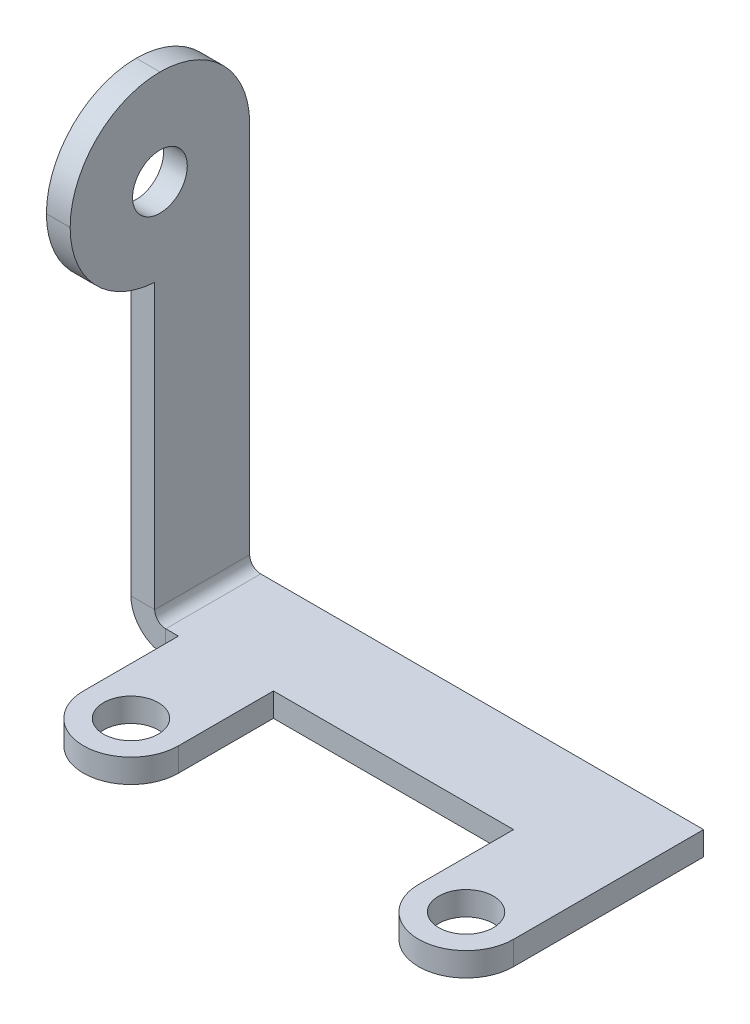
ISO-10303-21;
HEADER;
FILE_DESCRIPTION(('STEP AP214'),'2;1');
FILE_NAME('part.step','',(''),(''),'','','');
FILE_SCHEMA(('AUTOMOTIVE_DESIGN { 1 0 10303 214 1 1 1 1 }'));
ENDSEC;
DATA;
#1=APPLICATION_CONTEXT('core data for automotive mechanical design processes');
#2=APPLICATION_PROTOCOL_DEFINITION('international standard','automotive_design',2000,#1);
#3=PRODUCT_CONTEXT('',#1,'mechanical');
#4=PRODUCT('Part','Part','',(#3));
#5=PRODUCT_RELATED_PRODUCT_CATEGORY('part','',(#4));
#6=PRODUCT_DEFINITION_FORMATION('','',#4);
#7=PRODUCT_DEFINITION_CONTEXT('part definition',#1,'design');
#8=PRODUCT_DEFINITION('design','',#6,#7);
#9=PRODUCT_DEFINITION_SHAPE('','',#8);
#10=(LENGTH_UNIT() NAMED_UNIT(*) SI_UNIT(.MILLI.,.METRE.));
#11=(NAMED_UNIT(*) PLANE_ANGLE_UNIT() SI_UNIT($,.RADIAN.));
#12=(NAMED_UNIT(*) SI_UNIT($,.STERADIAN.) SOLID_ANGLE_UNIT());
#13=UNCERTAINTY_MEASURE_WITH_UNIT(LENGTH_MEASURE(1.E-05),#10,'distance_accuracy_value','');
#14=(GEOMETRIC_REPRESENTATION_CONTEXT(3) GLOBAL_UNCERTAINTY_ASSIGNED_CONTEXT((#13)) GLOBAL_UNIT_ASSIGNED_CONTEXT((#10,
#11,#12)) REPRESENTATION_CONTEXT('',''));
#15=CARTESIAN_POINT('',(0.,0.,0.));
#16=DIRECTION('',(0.,0.,1.));
#17=DIRECTION('',(1.,0.,0.));
#18=AXIS2_PLACEMENT_3D('',#15,#16,#17);
#19=CARTESIAN_POINT('',(-22.4,1.5875,0.));
#20=DIRECTION('',(0.,-1.,0.));
#21=DIRECTION('',(0.,0.,-1.));
#22=AXIS2_PLACEMENT_3D('',#19,#20,#21);
#23=PLANE('',#22);
#24=CARTESIAN_POINT('',(-22.4,1.5875,0.));
#25=DIRECTION('',(0.,1.,0.));
#26=DIRECTION('',(0.,0.,1.));
#27=AXIS2_PLACEMENT_3D('',#24,#25,#26);
#28=CIRCLE('',#27,1.8288);
#29=CARTESIAN_POINT('',(-22.4,1.5875,1.8288));
#30=VERTEX_POINT('',#29);
#31=EDGE_CURVE('E225',#30,#30,#28,.T.);
#32=ORIENTED_EDGE('',*,*,#31,.F.);
#33=EDGE_LOOP('',(#32));
#34=FACE_BOUND('',#33,.T.);
#35=CARTESIAN_POINT('',(0.,1.5875,0.));
#36=DIRECTION('',(0.,1.,0.));
#37=DIRECTION('',(0.,0.,1.));
#38=AXIS2_PLACEMENT_3D('',#35,#36,#37);
#39=CIRCLE('',#38,1.8288);
#40=CARTESIAN_POINT('',(0.,1.5875,1.8288));
#41=VERTEX_POINT('',#40);
#42=EDGE_CURVE('E231',#41,#41,#39,.T.);
#43=ORIENTED_EDGE('',*,*,#42,.F.);
#44=EDGE_LOOP('',(#43));
#45=FACE_BOUND('',#44,.T.);
#46=DIRECTION('',(0.,0.,1.));
#47=VECTOR('',#46,1.);
#48=CARTESIAN_POINT('',(-26.4259,1.5875,-6.35));
#49=LINE('',#48,#47);
#50=CARTESIAN_POINT('',(-26.4259,1.5875,-6.35));
#51=VERTEX_POINT('',#50);
#52=CARTESIAN_POINT('',(-26.4259,1.5875,-12.7));
#53=VERTEX_POINT('',#52);
#54=EDGE_CURVE('E215',#51,#53,#49,.F.);
#55=ORIENTED_EDGE('',*,*,#54,.F.);
#56=DIRECTION('',(1.,0.,0.));
#57=VECTOR('',#56,1.);
#58=CARTESIAN_POINT('',(-25.575,1.5875,-6.35));
#59=LINE('',#58,#57);
#60=CARTESIAN_POINT('',(-25.575,1.5875,-6.35));
#61=VERTEX_POINT('',#60);
#62=EDGE_CURVE('E237',#51,#61,#59,.T.);
#63=ORIENTED_EDGE('',*,*,#62,.T.);
#64=DIRECTION('',(0.,0.,1.));
#65=VECTOR('',#64,1.);
#66=CARTESIAN_POINT('',(-25.575,1.5875,0.));
#67=LINE('',#66,#65);
#68=CARTESIAN_POINT('',(-25.575,1.5875,0.));
#69=VERTEX_POINT('',#68);
#70=EDGE_CURVE('E239',#61,#69,#67,.T.);
#71=ORIENTED_EDGE('',*,*,#70,.T.);
#72=CARTESIAN_POINT('',(-22.4,1.5875,0.));
#73=DIRECTION('',(0.,1.,0.));
#74=DIRECTION('',(0.,0.,-1.));
#75=AXIS2_PLACEMENT_3D('',#72,#73,#74);
#76=CIRCLE('',#75,3.175);
#77=CARTESIAN_POINT('',(-19.225,1.5875,0.));
#78=VERTEX_POINT('',#77);
#79=EDGE_CURVE('E242',#69,#78,#76,.T.);
#80=ORIENTED_EDGE('',*,*,#79,.T.);
#81=DIRECTION('',(0.,0.,-1.));
#82=VECTOR('',#81,1.);
#83=CARTESIAN_POINT('',(-19.225,1.5875,-6.35));
#84=LINE('',#83,#82);
#85=CARTESIAN_POINT('',(-19.225,1.5875,-6.35));
#86=VERTEX_POINT('',#85);
#87=EDGE_CURVE('E244',#78,#86,#84,.T.);
#88=ORIENTED_EDGE('',*,*,#87,.T.);
#89=DIRECTION('',(1.,0.,0.));
#90=VECTOR('',#89,1.);
#91=CARTESIAN_POINT('',(-3.175,1.5875,-6.35));
#92=LINE('',#91,#90);
#93=CARTESIAN_POINT('',(-3.175,1.5875,-6.35));
#94=VERTEX_POINT('',#93);
#95=EDGE_CURVE('E246',#86,#94,#92,.T.);
#96=ORIENTED_EDGE('',*,*,#95,.T.);
#97=DIRECTION('',(0.,0.,1.));
#98=VECTOR('',#97,1.);
#99=CARTESIAN_POINT('',(-3.175,1.5875,0.));
#100=LINE('',#99,#98);
#101=CARTESIAN_POINT('',(-3.175,1.5875,0.));
#102=VERTEX_POINT('',#101);
#103=EDGE_CURVE('E248',#94,#102,#100,.T.);
#104=ORIENTED_EDGE('',*,*,#103,.T.);
#105=CARTESIAN_POINT('',(0.,1.5875,0.));
#106=DIRECTION('',(0.,1.,0.));
#107=DIRECTION('',(0.,0.,-1.));
#108=AXIS2_PLACEMENT_3D('',#105,#106,#107);
#109=CIRCLE('',#108,3.175);
#110=CARTESIAN_POINT('',(3.175,1.5875,0.));
#111=VERTEX_POINT('',#110);
#112=EDGE_CURVE('E250',#102,#111,#109,.T.);
#113=ORIENTED_EDGE('',*,*,#112,.T.);
#114=DIRECTION('',(0.,0.,-1.));
#115=VECTOR('',#114,1.);
#116=CARTESIAN_POINT('',(3.175,1.5875,-6.35));
#117=LINE('',#116,#115);
#118=CARTESIAN_POINT('',(3.175,1.5875,-12.7));
#119=VERTEX_POINT('',#118);
#120=EDGE_CURVE('E252',#111,#119,#117,.T.);
#121=ORIENTED_EDGE('',*,*,#120,.T.);
#122=DIRECTION('',(-1.,0.,0.));
#123=VECTOR('',#122,1.);
#124=CARTESIAN_POINT('',(3.175,1.5875,-12.7));
#125=LINE('',#124,#123);
#126=EDGE_CURVE('E254',#119,#53,#125,.T.);
#127=ORIENTED_EDGE('',*,*,#126,.T.);
#128=EDGE_LOOP('',(#55,#63,#71,#80,#88,#96,#104,#113,#121,#127));
#129=FACE_BOUND('',#128,.T.);
#130=ADVANCED_FACE('F39',(#34,#45,#129),#23,.F.);
#131=CARTESIAN_POINT('',(-22.4,0.,0.));
#132=DIRECTION('',(0.,-1.,0.));
#133=DIRECTION('',(0.,0.,-1.));
#134=AXIS2_PLACEMENT_3D('',#131,#132,#133);
#135=PLANE('',#134);
#136=CARTESIAN_POINT('',(0.,0.,0.));
#137=DIRECTION('',(0.,1.,0.));
#138=DIRECTION('',(0.,0.,1.));
#139=AXIS2_PLACEMENT_3D('',#136,#137,#138);
#140=CIRCLE('',#139,1.8288);
#141=CARTESIAN_POINT('',(0.,0.,1.8288));
#142=VERTEX_POINT('',#141);
#143=EDGE_CURVE('E228',#142,#142,#140,.T.);
#144=ORIENTED_EDGE('',*,*,#143,.T.);
#145=EDGE_LOOP('',(#144));
#146=FACE_BOUND('',#145,.T.);
#147=CARTESIAN_POINT('',(-22.4,0.,0.));
#148=DIRECTION('',(0.,1.,0.));
#149=DIRECTION('',(0.,0.,1.));
#150=AXIS2_PLACEMENT_3D('',#147,#148,#149);
#151=CIRCLE('',#150,1.8288);
#152=CARTESIAN_POINT('',(-22.4,0.,1.8288));
#153=VERTEX_POINT('',#152);
#154=EDGE_CURVE('E222',#153,#153,#151,.T.);
#155=ORIENTED_EDGE('',*,*,#154,.T.);
#156=EDGE_LOOP('',(#155));
#157=FACE_BOUND('',#156,.T.);
#158=DIRECTION('',(1.,0.,0.));
#159=VECTOR('',#158,1.);
#160=CARTESIAN_POINT('',(-25.575,0.,-6.35));
#161=LINE('',#160,#159);
#162=CARTESIAN_POINT('',(-26.4259,0.,-6.35));
#163=VERTEX_POINT('',#162);
#164=CARTESIAN_POINT('',(-25.575,0.,-6.35));
#165=VERTEX_POINT('',#164);
#166=EDGE_CURVE('E234',#163,#165,#161,.T.);
#167=ORIENTED_EDGE('',*,*,#166,.F.);
#168=DIRECTION('',(0.,0.,1.));
#169=VECTOR('',#168,1.);
#170=CARTESIAN_POINT('',(-26.4259,0.,-6.35));
#171=LINE('',#170,#169);
#172=CARTESIAN_POINT('',(-26.4259,0.,-12.7));
#173=VERTEX_POINT('',#172);
#174=EDGE_CURVE('E202',#163,#173,#171,.F.);
#175=ORIENTED_EDGE('',*,*,#174,.T.);
#176=DIRECTION('',(-1.,0.,0.));
#177=VECTOR('',#176,1.);
#178=CARTESIAN_POINT('',(3.175,0.,-12.7));
#179=LINE('',#178,#177);
#180=CARTESIAN_POINT('',(3.175,0.,-12.7));
#181=VERTEX_POINT('',#180);
#182=EDGE_CURVE('E240',#181,#173,#179,.T.);
#183=ORIENTED_EDGE('',*,*,#182,.F.);
#184=DIRECTION('',(0.,0.,-1.));
#185=VECTOR('',#184,1.);
#186=CARTESIAN_POINT('',(3.175,0.,-6.35));
#187=LINE('',#186,#185);
#188=CARTESIAN_POINT('',(3.175,0.,0.));
#189=VERTEX_POINT('',#188);
#190=EDGE_CURVE('E272',#189,#181,#187,.T.);
#191=ORIENTED_EDGE('',*,*,#190,.F.);
#192=CARTESIAN_POINT('',(0.,0.,0.));
#193=DIRECTION('',(0.,1.,0.));
#194=DIRECTION('',(0.,0.,-1.));
#195=AXIS2_PLACEMENT_3D('',#192,#193,#194);
#196=CIRCLE('',#195,3.175);
#197=CARTESIAN_POINT('',(-3.175,0.,0.));
#198=VERTEX_POINT('',#197);
#199=EDGE_CURVE('E269',#198,#189,#196,.T.);
#200=ORIENTED_EDGE('',*,*,#199,.F.);
#201=DIRECTION('',(0.,0.,1.));
#202=VECTOR('',#201,1.);
#203=CARTESIAN_POINT('',(-3.175,0.,0.));
#204=LINE('',#203,#202);
#205=CARTESIAN_POINT('',(-3.175,0.,-6.35));
#206=VERTEX_POINT('',#205);
#207=EDGE_CURVE('E267',#206,#198,#204,.T.);
#208=ORIENTED_EDGE('',*,*,#207,.F.);
#209=DIRECTION('',(1.,0.,0.));
#210=VECTOR('',#209,1.);
#211=CARTESIAN_POINT('',(-3.175,0.,-6.35));
#212=LINE('',#211,#210);
#213=CARTESIAN_POINT('',(-19.225,0.,-6.35));
#214=VERTEX_POINT('',#213);
#215=EDGE_CURVE('E265',#214,#206,#212,.T.);
#216=ORIENTED_EDGE('',*,*,#215,.F.);
#217=DIRECTION('',(0.,0.,-1.));
#218=VECTOR('',#217,1.);
#219=CARTESIAN_POINT('',(-19.225,0.,-6.35));
#220=LINE('',#219,#218);
#221=CARTESIAN_POINT('',(-19.225,0.,0.));
#222=VERTEX_POINT('',#221);
#223=EDGE_CURVE('E263',#222,#214,#220,.T.);
#224=ORIENTED_EDGE('',*,*,#223,.F.);
#225=CARTESIAN_POINT('',(-22.4,0.,0.));
#226=DIRECTION('',(0.,1.,0.));
#227=DIRECTION('',(0.,0.,-1.));
#228=AXIS2_PLACEMENT_3D('',#225,#226,#227);
#229=CIRCLE('',#228,3.175);
#230=CARTESIAN_POINT('',(-25.575,0.,0.));
#231=VERTEX_POINT('',#230);
#232=EDGE_CURVE('E261',#231,#222,#229,.T.);
#233=ORIENTED_EDGE('',*,*,#232,.F.);
#234=DIRECTION('',(0.,0.,1.));
#235=VECTOR('',#234,1.);
#236=CARTESIAN_POINT('',(-25.575,0.,0.));
#237=LINE('',#236,#235);
#238=EDGE_CURVE('E259',#165,#231,#237,.T.);
#239=ORIENTED_EDGE('',*,*,#238,.F.);
#240=EDGE_LOOP('',(#167,#175,#183,#191,#200,#208,#216,#224,#233,#239));
#241=FACE_BOUND('',#240,.T.);
#242=ADVANCED_FACE('F345',(#146,#157,#241),#135,.T.);
#243=CARTESIAN_POINT('',(-25.575,1.5875,-6.35));
#244=DIRECTION('',(0.,0.,-1.));
#245=DIRECTION('',(-1.,0.,0.));
#246=AXIS2_PLACEMENT_3D('',#243,#244,#245);
#247=PLANE('',#246);
#248=DIRECTION('',(0.,-1.,0.));
#249=VECTOR('',#248,1.);
#250=CARTESIAN_POINT('',(-26.4259,1.5875,-6.35));
#251=LINE('',#250,#249);
#252=EDGE_CURVE('E209',#51,#163,#251,.T.);
#253=ORIENTED_EDGE('',*,*,#252,.T.);
#254=ORIENTED_EDGE('',*,*,#166,.T.);
#255=DIRECTION('',(0.,-1.,0.));
#256=VECTOR('',#255,1.);
#257=CARTESIAN_POINT('',(-25.575,1.5875,-6.35));
#258=LINE('',#257,#256);
#259=EDGE_CURVE('E296',#61,#165,#258,.T.);
#260=ORIENTED_EDGE('',*,*,#259,.F.);
#261=ORIENTED_EDGE('',*,*,#62,.F.);
#262=EDGE_LOOP('',(#253,#254,#260,#261));
#263=FACE_BOUND('',#262,.T.);
#264=ADVANCED_FACE('F351',(#263),#247,.F.);
#265=CARTESIAN_POINT('',(3.175,1.5875,-12.7));
#266=DIRECTION('',(0.,0.,1.));
#267=DIRECTION('',(1.,0.,0.));
#268=AXIS2_PLACEMENT_3D('',#265,#266,#267);
#269=PLANE('',#268);
#270=DIRECTION('',(0.,-1.,0.));
#271=VECTOR('',#270,1.);
#272=CARTESIAN_POINT('',(-26.4259,1.5875,-12.7));
#273=LINE('',#272,#271);
#274=EDGE_CURVE('E219',#53,#173,#273,.T.);
#275=ORIENTED_EDGE('',*,*,#274,.F.);
#276=ORIENTED_EDGE('',*,*,#126,.F.);
#277=DIRECTION('',(0.,-1.,0.));
#278=VECTOR('',#277,1.);
#279=CARTESIAN_POINT('',(3.175,1.5875,-12.7));
#280=LINE('',#279,#278);
#281=EDGE_CURVE('E257',#119,#181,#280,.T.);
#282=ORIENTED_EDGE('',*,*,#281,.T.);
#283=ORIENTED_EDGE('',*,*,#182,.T.);
#284=EDGE_LOOP('',(#275,#276,#282,#283));
#285=FACE_BOUND('',#284,.T.);
#286=ADVANCED_FACE('F360',(#285),#269,.F.);
#287=CARTESIAN_POINT('',(-25.575,1.5875,0.));
#288=DIRECTION('',(1.,0.,0.));
#289=DIRECTION('',(0.,0.,-1.));
#290=AXIS2_PLACEMENT_3D('',#287,#288,#289);
#291=PLANE('',#290);
#292=ORIENTED_EDGE('',*,*,#238,.T.);
#293=DIRECTION('',(0.,-1.,0.));
#294=VECTOR('',#293,1.);
#295=CARTESIAN_POINT('',(-25.575,1.5875,0.));
#296=LINE('',#295,#294);
#297=EDGE_CURVE('E293',#69,#231,#296,.T.);
#298=ORIENTED_EDGE('',*,*,#297,.F.);
#299=ORIENTED_EDGE('',*,*,#70,.F.);
#300=ORIENTED_EDGE('',*,*,#259,.T.);
#301=EDGE_LOOP('',(#292,#298,#299,#300));
#302=FACE_BOUND('',#301,.T.);
#303=ADVANCED_FACE('F363',(#302),#291,.F.);
#304=CARTESIAN_POINT('',(-22.4,1.5875,0.));
#305=DIRECTION('',(0.,-1.,0.));
#306=DIRECTION('',(0.,0.,-1.));
#307=AXIS2_PLACEMENT_3D('',#304,#305,#306);
#308=CYLINDRICAL_SURFACE('',#307,3.175);
#309=ORIENTED_EDGE('',*,*,#232,.T.);
#310=DIRECTION('',(0.,-1.,0.));
#311=VECTOR('',#310,1.);
#312=CARTESIAN_POINT('',(-19.225,1.5875,0.));
#313=LINE('',#312,#311);
#314=EDGE_CURVE('E290',#78,#222,#313,.T.);
#315=ORIENTED_EDGE('',*,*,#314,.F.);
#316=ORIENTED_EDGE('',*,*,#79,.F.);
#317=ORIENTED_EDGE('',*,*,#297,.T.);
#318=EDGE_LOOP('',(#309,#315,#316,#317));
#319=FACE_BOUND('',#318,.T.);
#320=ADVANCED_FACE('F384',(#319),#308,.T.);
#321=CARTESIAN_POINT('',(-19.225,1.5875,-6.35));
#322=DIRECTION('',(-1.,0.,0.));
#323=DIRECTION('',(0.,0.,1.));
#324=AXIS2_PLACEMENT_3D('',#321,#322,#323);
#325=PLANE('',#324);
#326=ORIENTED_EDGE('',*,*,#223,.T.);
#327=DIRECTION('',(0.,-1.,0.));
#328=VECTOR('',#327,1.);
#329=CARTESIAN_POINT('',(-19.225,1.5875,-6.35));
#330=LINE('',#329,#328);
#331=EDGE_CURVE('E287',#86,#214,#330,.T.);
#332=ORIENTED_EDGE('',*,*,#331,.F.);
#333=ORIENTED_EDGE('',*,*,#87,.F.);
#334=ORIENTED_EDGE('',*,*,#314,.T.);
#335=EDGE_LOOP('',(#326,#332,#333,#334));
#336=FACE_BOUND('',#335,.T.);
#337=ADVANCED_FACE('F380',(#336),#325,.F.);
#338=CARTESIAN_POINT('',(-3.175,1.5875,-6.35));
#339=DIRECTION('',(0.,0.,-1.));
#340=DIRECTION('',(-1.,0.,0.));
#341=AXIS2_PLACEMENT_3D('',#338,#339,#340);
#342=PLANE('',#341);
#343=ORIENTED_EDGE('',*,*,#215,.T.);
#344=DIRECTION('',(0.,-1.,0.));
#345=VECTOR('',#344,1.);
#346=CARTESIAN_POINT('',(-3.175,1.5875,-6.35));
#347=LINE('',#346,#345);
#348=EDGE_CURVE('E284',#94,#206,#347,.T.);
#349=ORIENTED_EDGE('',*,*,#348,.F.);
#350=ORIENTED_EDGE('',*,*,#95,.F.);
#351=ORIENTED_EDGE('',*,*,#331,.T.);
#352=EDGE_LOOP('',(#343,#349,#350,#351));
#353=FACE_BOUND('',#352,.T.);
#354=ADVANCED_FACE('F376',(#353),#342,.F.);
#355=CARTESIAN_POINT('',(-3.175,1.5875,0.));
#356=DIRECTION('',(1.,0.,0.));
#357=DIRECTION('',(0.,0.,-1.));
#358=AXIS2_PLACEMENT_3D('',#355,#356,#357);
#359=PLANE('',#358);
#360=ORIENTED_EDGE('',*,*,#207,.T.);
#361=DIRECTION('',(0.,-1.,0.));
#362=VECTOR('',#361,1.);
#363=CARTESIAN_POINT('',(-3.175,1.5875,0.));
#364=LINE('',#363,#362);
#365=EDGE_CURVE('E281',#102,#198,#364,.T.);
#366=ORIENTED_EDGE('',*,*,#365,.F.);
#367=ORIENTED_EDGE('',*,*,#103,.F.);
#368=ORIENTED_EDGE('',*,*,#348,.T.);
#369=EDGE_LOOP('',(#360,#366,#367,#368));
#370=FACE_BOUND('',#369,.T.);
#371=ADVANCED_FACE('F372',(#370),#359,.F.);
#372=CARTESIAN_POINT('',(0.,1.5875,0.));
#373=DIRECTION('',(0.,-1.,0.));
#374=DIRECTION('',(0.,0.,-1.));
#375=AXIS2_PLACEMENT_3D('',#372,#373,#374);
#376=CYLINDRICAL_SURFACE('',#375,3.175);
#377=ORIENTED_EDGE('',*,*,#199,.T.);
#378=DIRECTION('',(0.,-1.,0.));
#379=VECTOR('',#378,1.);
#380=CARTESIAN_POINT('',(3.175,1.5875,0.));
#381=LINE('',#380,#379);
#382=EDGE_CURVE('E278',#111,#189,#381,.T.);
#383=ORIENTED_EDGE('',*,*,#382,.F.);
#384=ORIENTED_EDGE('',*,*,#112,.F.);
#385=ORIENTED_EDGE('',*,*,#365,.T.);
#386=EDGE_LOOP('',(#377,#383,#384,#385));
#387=FACE_BOUND('',#386,.T.);
#388=ADVANCED_FACE('F368',(#387),#376,.T.);
#389=CARTESIAN_POINT('',(3.175,1.5875,-6.35));
#390=DIRECTION('',(-1.,0.,0.));
#391=DIRECTION('',(0.,0.,1.));
#392=AXIS2_PLACEMENT_3D('',#389,#390,#391);
#393=PLANE('',#392);
#394=ORIENTED_EDGE('',*,*,#190,.T.);
#395=ORIENTED_EDGE('',*,*,#281,.F.);
#396=ORIENTED_EDGE('',*,*,#120,.F.);
#397=ORIENTED_EDGE('',*,*,#382,.T.);
#398=EDGE_LOOP('',(#394,#395,#396,#397));
#399=FACE_BOUND('',#398,.T.);
#400=ADVANCED_FACE('F365',(#399),#393,.F.);
#401=CARTESIAN_POINT('',(0.,1.5875,0.));
#402=DIRECTION('',(0.,-1.,0.));
#403=DIRECTION('',(0.,0.,-1.));
#404=AXIS2_PLACEMENT_3D('',#401,#402,#403);
#405=CYLINDRICAL_SURFACE('',#404,1.8288);
#406=ORIENTED_EDGE('',*,*,#42,.T.);
#407=EDGE_LOOP('',(#406));
#408=FACE_BOUND('',#407,.T.);
#409=ORIENTED_EDGE('',*,*,#143,.F.);
#410=EDGE_LOOP('',(#409));
#411=FACE_BOUND('',#410,.T.);
#412=ADVANCED_FACE('F357',(#408,#411),#405,.F.);
#413=CARTESIAN_POINT('',(-22.4,1.5875,0.));
#414=DIRECTION('',(0.,-1.,0.));
#415=DIRECTION('',(0.,0.,-1.));
#416=AXIS2_PLACEMENT_3D('',#413,#414,#415);
#417=CYLINDRICAL_SURFACE('',#416,1.8288);
#418=ORIENTED_EDGE('',*,*,#31,.T.);
#419=EDGE_LOOP('',(#418));
#420=FACE_BOUND('',#419,.T.);
#421=ORIENTED_EDGE('',*,*,#154,.F.);
#422=EDGE_LOOP('',(#421));
#423=FACE_BOUND('',#422,.T.);
#424=ADVANCED_FACE('F477',(#420,#423),#417,.F.);
#425=CARTESIAN_POINT('',(-26.4259,2.3241,-12.7));
#426=DIRECTION('',(0.,0.,-1.));
#427=DIRECTION('',(-1.,0.,0.));
#428=AXIS2_PLACEMENT_3D('',#425,#426,#427);
#429=PLANE('',#428);
#430=DIRECTION('',(-1.,0.,0.));
#431=VECTOR('',#430,1.);
#432=CARTESIAN_POINT('',(-27.1625,2.3241,-12.7));
#433=LINE('',#432,#431);
#434=CARTESIAN_POINT('',(-27.1625,2.3241,-12.7));
#435=VERTEX_POINT('',#434);
#436=CARTESIAN_POINT('',(-28.75,2.32409999999999,-12.7));
#437=VERTEX_POINT('',#436);
#438=EDGE_CURVE('E183',#435,#437,#433,.T.);
#439=ORIENTED_EDGE('',*,*,#438,.F.);
#440=CARTESIAN_POINT('',(-26.4259,2.3241,-12.7));
#441=DIRECTION('',(0.,0.,1.));
#442=DIRECTION('',(1.,0.,0.));
#443=AXIS2_PLACEMENT_3D('',#440,#441,#442);
#444=CIRCLE('',#443,0.7366);
#445=EDGE_CURVE('E212',#53,#435,#444,.F.);
#446=ORIENTED_EDGE('',*,*,#445,.F.);
#447=ORIENTED_EDGE('',*,*,#274,.T.);
#448=CARTESIAN_POINT('',(-26.4259,2.3241,-12.7));
#449=DIRECTION('',(0.,0.,1.));
#450=DIRECTION('',(1.,0.,0.));
#451=AXIS2_PLACEMENT_3D('',#448,#449,#450);
#452=CIRCLE('',#451,2.3241);
#453=EDGE_CURVE('E205',#173,#437,#452,.F.);
#454=ORIENTED_EDGE('',*,*,#453,.T.);
#455=EDGE_LOOP('',(#439,#446,#447,#454));
#456=FACE_BOUND('',#455,.T.);
#457=ADVANCED_FACE('F469',(#456),#429,.T.);
#458=CARTESIAN_POINT('',(-26.4259,2.3241,-6.35));
#459=DIRECTION('',(0.,0.,-1.));
#460=DIRECTION('',(-1.,0.,0.));
#461=AXIS2_PLACEMENT_3D('',#458,#459,#460);
#462=PLANE('',#461);
#463=CARTESIAN_POINT('',(-26.4259,2.3241,-6.35));
#464=DIRECTION('',(0.,0.,1.));
#465=DIRECTION('',(1.,0.,0.));
#466=AXIS2_PLACEMENT_3D('',#463,#464,#465);
#467=CIRCLE('',#466,0.7366);
#468=CARTESIAN_POINT('',(-27.1625,2.3241,-6.35));
#469=VERTEX_POINT('',#468);
#470=EDGE_CURVE('E199',#469,#51,#467,.T.);
#471=ORIENTED_EDGE('',*,*,#470,.F.);
#472=DIRECTION('',(-1.,0.,0.));
#473=VECTOR('',#472,1.);
#474=CARTESIAN_POINT('',(-27.1625,2.3241,-6.35));
#475=LINE('',#474,#473);
#476=CARTESIAN_POINT('',(-28.75,2.32409999999999,-6.35));
#477=VERTEX_POINT('',#476);
#478=EDGE_CURVE('E177',#469,#477,#475,.T.);
#479=ORIENTED_EDGE('',*,*,#478,.T.);
#480=CARTESIAN_POINT('',(-26.4259,2.3241,-6.35));
#481=DIRECTION('',(0.,0.,1.));
#482=DIRECTION('',(1.,0.,0.));
#483=AXIS2_PLACEMENT_3D('',#480,#481,#482);
#484=CIRCLE('',#483,2.3241);
#485=EDGE_CURVE('E206',#477,#163,#484,.T.);
#486=ORIENTED_EDGE('',*,*,#485,.T.);
#487=ORIENTED_EDGE('',*,*,#252,.F.);
#488=EDGE_LOOP('',(#471,#479,#486,#487));
#489=FACE_BOUND('',#488,.T.);
#490=ADVANCED_FACE('F461',(#489),#462,.F.);
#491=CARTESIAN_POINT('',(-26.4259,2.3241,-6.35));
#492=DIRECTION('',(0.,0.,1.));
#493=DIRECTION('',(-1.,0.,0.));
#494=AXIS2_PLACEMENT_3D('',#491,#492,#493);
#495=CYLINDRICAL_SURFACE('',#494,2.3241);
#496=ORIENTED_EDGE('',*,*,#174,.F.);
#497=ORIENTED_EDGE('',*,*,#485,.F.);
#498=DIRECTION('',(0.,0.,-1.));
#499=VECTOR('',#498,1.);
#500=CARTESIAN_POINT('',(-28.75,2.32409999999999,0.));
#501=LINE('',#500,#499);
#502=EDGE_CURVE('E179',#477,#437,#501,.T.);
#503=ORIENTED_EDGE('',*,*,#502,.T.);
#504=ORIENTED_EDGE('',*,*,#453,.F.);
#505=EDGE_LOOP('',(#496,#497,#503,#504));
#506=FACE_BOUND('',#505,.T.);
#507=ADVANCED_FACE('F454',(#506),#495,.T.);
#508=CARTESIAN_POINT('',(-26.4259,2.3241,-6.35));
#509=DIRECTION('',(0.,0.,1.));
#510=DIRECTION('',(-1.,0.,0.));
#511=AXIS2_PLACEMENT_3D('',#508,#509,#510);
#512=CYLINDRICAL_SURFACE('',#511,0.7366);
#513=ORIENTED_EDGE('',*,*,#54,.T.);
#514=ORIENTED_EDGE('',*,*,#445,.T.);
#515=DIRECTION('',(0.,0.,1.));
#516=VECTOR('',#515,1.);
#517=CARTESIAN_POINT('',(-27.1625,2.3241,-12.7));
#518=LINE('',#517,#516);
#519=EDGE_CURVE('E186',#435,#469,#518,.T.);
#520=ORIENTED_EDGE('',*,*,#519,.T.);
#521=ORIENTED_EDGE('',*,*,#470,.T.);
#522=EDGE_LOOP('',(#513,#514,#520,#521));
#523=FACE_BOUND('',#522,.T.);
#524=ADVANCED_FACE('F444',(#523),#512,.F.);
#525=CARTESIAN_POINT('',(-28.7500000000001,33.2755,-6.35));
#526=DIRECTION('',(0.,0.,-1.));
#527=DIRECTION('',(0.,1.,0.));
#528=AXIS2_PLACEMENT_3D('',#525,#526,#527);
#529=PLANE('',#528);
#530=DIRECTION('',(0.,1.,0.));
#531=VECTOR('',#530,1.);
#532=CARTESIAN_POINT('',(-27.1625000000001,33.2755,-6.35));
#533=LINE('',#532,#531);
#534=CARTESIAN_POINT('',(-27.1625000000001,21.2755,-6.35));
#535=VERTEX_POINT('',#534);
#536=EDGE_CURVE('E161',#469,#535,#533,.T.);
#537=ORIENTED_EDGE('',*,*,#536,.T.);
#538=DIRECTION('',(-1.,0.,0.));
#539=VECTOR('',#538,1.);
#540=CARTESIAN_POINT('',(-27.1625000000001,21.2755,-6.35));
#541=LINE('',#540,#539);
#542=CARTESIAN_POINT('',(-28.7500000000001,21.2755,-6.35));
#543=VERTEX_POINT('',#542);
#544=EDGE_CURVE('E174',#535,#543,#541,.T.);
#545=ORIENTED_EDGE('',*,*,#544,.T.);
#546=DIRECTION('',(0.,1.,0.));
#547=VECTOR('',#546,1.);
#548=CARTESIAN_POINT('',(-28.7500000000001,33.2755,-6.35));
#549=LINE('',#548,#547);
#550=EDGE_CURVE('E196',#477,#543,#549,.T.);
#551=ORIENTED_EDGE('',*,*,#550,.F.);
#552=ORIENTED_EDGE('',*,*,#478,.F.);
#553=EDGE_LOOP('',(#537,#545,#551,#552));
#554=FACE_BOUND('',#553,.T.);
#555=ADVANCED_FACE('F172',(#554),#529,.F.);
#556=CARTESIAN_POINT('',(-28.75,1.58749999999999,-12.7));
#557=DIRECTION('',(0.,0.,1.));
#558=DIRECTION('',(1.,0.,0.));
#559=AXIS2_PLACEMENT_3D('',#556,#557,#558);
#560=PLANE('',#559);
#561=DIRECTION('',(0.,-1.,0.));
#562=VECTOR('',#561,1.);
#563=CARTESIAN_POINT('',(-28.75,1.58749999999999,-12.7));
#564=LINE('',#563,#562);
#565=CARTESIAN_POINT('',(-28.7500000000001,27.2755,-12.7));
#566=VERTEX_POINT('',#565);
#567=EDGE_CURVE('E198',#566,#437,#564,.T.);
#568=ORIENTED_EDGE('',*,*,#567,.F.);
#569=DIRECTION('',(1.,0.,0.));
#570=VECTOR('',#569,1.);
#571=CARTESIAN_POINT('',(-28.7500000000001,27.2755,-12.7));
#572=LINE('',#571,#570);
#573=CARTESIAN_POINT('',(-27.1625000000001,27.2755,-12.7));
#574=VERTEX_POINT('',#573);
#575=EDGE_CURVE('E11',#566,#574,#572,.T.);
#576=ORIENTED_EDGE('',*,*,#575,.T.);
#577=DIRECTION('',(0.,-1.,0.));
#578=VECTOR('',#577,1.);
#579=CARTESIAN_POINT('',(-27.1625,1.5875,-12.7));
#580=LINE('',#579,#578);
#581=EDGE_CURVE('E178',#574,#435,#580,.T.);
#582=ORIENTED_EDGE('',*,*,#581,.T.);
#583=ORIENTED_EDGE('',*,*,#438,.T.);
#584=EDGE_LOOP('',(#568,#576,#582,#583));
#585=FACE_BOUND('',#584,.T.);
#586=ADVANCED_FACE('F334',(#585),#560,.F.);
#587=CARTESIAN_POINT('',(-28.75,-1.00709455060092E-13,0.));
#588=DIRECTION('',(1.,0.,0.));
#589=DIRECTION('',(0.,1.,0.));
#590=AXIS2_PLACEMENT_3D('',#587,#588,#589);
#591=PLANE('',#590);
#592=CARTESIAN_POINT('',(-28.7500000000001,26.9255,-6.70000000000106));
#593=DIRECTION('',(-1.,0.,0.));
#594=DIRECTION('',(0.,-1.,0.));
#595=AXIS2_PLACEMENT_3D('',#592,#593,#594);
#596=CIRCLE('',#595,1.82880000000002);
#597=CARTESIAN_POINT('',(-28.7500000000001,25.0967,-6.70000000000106));
#598=VERTEX_POINT('',#597);
#599=EDGE_CURVE('E303',#598,#598,#596,.T.);
#600=ORIENTED_EDGE('',*,*,#599,.F.);
#601=EDGE_LOOP('',(#600));
#602=FACE_BOUND('',#601,.T.);
#603=ORIENTED_EDGE('',*,*,#550,.T.);
#604=CARTESIAN_POINT('',(-28.7500000000001,27.2652829676876,-6.69999999999999));
#605=DIRECTION('',(1.,0.,0.));
#606=DIRECTION('',(0.,1.,0.));
#607=AXIS2_PLACEMENT_3D('',#604,#605,#606);
#608=CIRCLE('',#607,6.);
#609=CARTESIAN_POINT('',(-28.7500000000001,27.2652829676876,-0.699999999999993));
#610=VERTEX_POINT('',#609);
#611=EDGE_CURVE('E182',#543,#610,#608,.F.);
#612=ORIENTED_EDGE('',*,*,#611,.T.);
#613=DIRECTION('',(0.,1.,0.));
#614=VECTOR('',#613,1.);
#615=CARTESIAN_POINT('',(-28.7500000000001,33.2755,-0.699999999999994));
#616=LINE('',#615,#614);
#617=CARTESIAN_POINT('',(-28.7500000000001,27.2755,-0.699999999999993));
#618=VERTEX_POINT('',#617);
#619=EDGE_CURVE('E188',#610,#618,#616,.T.);
#620=ORIENTED_EDGE('',*,*,#619,.T.);
#621=CARTESIAN_POINT('',(-28.7500000000001,27.2755,-6.69999999999999));
#622=DIRECTION('',(1.,0.,0.));
#623=DIRECTION('',(0.,1.,0.));
#624=AXIS2_PLACEMENT_3D('',#621,#622,#623);
#625=CIRCLE('',#624,6.);
#626=CARTESIAN_POINT('',(-28.7500000000001,33.2755,-6.69999999999999));
#627=VERTEX_POINT('',#626);
#628=EDGE_CURVE('E305',#618,#627,#625,.F.);
#629=ORIENTED_EDGE('',*,*,#628,.T.);
#630=CARTESIAN_POINT('',(-28.7500000000001,27.2755,-6.69999999999999));
#631=DIRECTION('',(1.,0.,0.));
#632=DIRECTION('',(0.,1.,0.));
#633=AXIS2_PLACEMENT_3D('',#630,#631,#632);
#634=CIRCLE('',#633,6.);
#635=EDGE_CURVE('E299',#627,#566,#634,.F.);
#636=ORIENTED_EDGE('',*,*,#635,.T.);
#637=ORIENTED_EDGE('',*,*,#567,.T.);
#638=ORIENTED_EDGE('',*,*,#502,.F.);
#639=EDGE_LOOP('',(#603,#612,#620,#629,#636,#637,#638));
#640=FACE_BOUND('',#639,.T.);
#641=ADVANCED_FACE('F325',(#602,#640),#591,.F.);
#642=CARTESIAN_POINT('',(-27.1625,0.,0.));
#643=DIRECTION('',(1.,0.,0.));
#644=DIRECTION('',(0.,1.,0.));
#645=AXIS2_PLACEMENT_3D('',#642,#643,#644);
#646=PLANE('',#645);
#647=CARTESIAN_POINT('',(-27.1625000000001,26.9255,-6.70000000000106));
#648=DIRECTION('',(1.,0.,0.));
#649=DIRECTION('',(0.,1.,0.));
#650=AXIS2_PLACEMENT_3D('',#647,#648,#649);
#651=CIRCLE('',#650,1.82880000000002);
#652=CARTESIAN_POINT('',(-27.1625000000001,28.7543,-6.70000000000106));
#653=VERTEX_POINT('',#652);
#654=EDGE_CURVE('E300',#653,#653,#651,.T.);
#655=ORIENTED_EDGE('',*,*,#654,.F.);
#656=EDGE_LOOP('',(#655));
#657=FACE_BOUND('',#656,.T.);
#658=DIRECTION('',(0.,1.,0.));
#659=VECTOR('',#658,1.);
#660=CARTESIAN_POINT('',(-27.1625000000001,33.2755,-0.699999999999994));
#661=LINE('',#660,#659);
#662=CARTESIAN_POINT('',(-27.1625000000001,27.2652829676876,-0.699999999999993));
#663=VERTEX_POINT('',#662);
#664=CARTESIAN_POINT('',(-27.1625000000001,27.2755,-0.699999999999993));
#665=VERTEX_POINT('',#664);
#666=EDGE_CURVE('E163',#663,#665,#661,.T.);
#667=ORIENTED_EDGE('',*,*,#666,.F.);
#668=CARTESIAN_POINT('',(-27.1625000000001,27.2652829676876,-6.69999999999999));
#669=DIRECTION('',(1.,0.,0.));
#670=DIRECTION('',(0.,1.,0.));
#671=AXIS2_PLACEMENT_3D('',#668,#669,#670);
#672=CIRCLE('',#671,6.);
#673=EDGE_CURVE('E48',#663,#535,#672,.T.);
#674=ORIENTED_EDGE('',*,*,#673,.T.);
#675=ORIENTED_EDGE('',*,*,#536,.F.);
#676=ORIENTED_EDGE('',*,*,#519,.F.);
#677=ORIENTED_EDGE('',*,*,#581,.F.);
#678=CARTESIAN_POINT('',(-27.1625000000001,27.2755,-6.69999999999999));
#679=DIRECTION('',(1.,0.,0.));
#680=DIRECTION('',(0.,1.,0.));
#681=AXIS2_PLACEMENT_3D('',#678,#679,#680);
#682=CIRCLE('',#681,6.);
#683=CARTESIAN_POINT('',(-27.1625000000001,33.2755,-6.69999999999999));
#684=VERTEX_POINT('',#683);
#685=EDGE_CURVE('E55',#574,#684,#682,.T.);
#686=ORIENTED_EDGE('',*,*,#685,.T.);
#687=CARTESIAN_POINT('',(-27.1625000000001,27.2755,-6.69999999999999));
#688=DIRECTION('',(1.,0.,0.));
#689=DIRECTION('',(0.,1.,0.));
#690=AXIS2_PLACEMENT_3D('',#687,#688,#689);
#691=CIRCLE('',#690,6.);
#692=EDGE_CURVE('E167',#684,#665,#691,.T.);
#693=ORIENTED_EDGE('',*,*,#692,.T.);
#694=EDGE_LOOP('',(#667,#674,#675,#676,#677,#686,#693));
#695=FACE_BOUND('',#694,.T.);
#696=ADVANCED_FACE('F159',(#657,#695),#646,.T.);
#697=CARTESIAN_POINT('',(-27.1625000000001,33.2755,-0.699999999999994));
#698=DIRECTION('',(0.,0.,1.));
#699=DIRECTION('',(0.,-1.,0.));
#700=AXIS2_PLACEMENT_3D('',#697,#698,#699);
#701=PLANE('',#700);
#702=ORIENTED_EDGE('',*,*,#619,.F.);
#703=DIRECTION('',(-1.,0.,0.));
#704=VECTOR('',#703,1.);
#705=CARTESIAN_POINT('',(-27.1625000000001,27.2652829676876,-0.699999999999993));
#706=LINE('',#705,#704);
#707=EDGE_CURVE('E311',#610,#663,#706,.F.);
#708=ORIENTED_EDGE('',*,*,#707,.T.);
#709=ORIENTED_EDGE('',*,*,#666,.T.);
#710=DIRECTION('',(-1.,0.,0.));
#711=VECTOR('',#710,1.);
#712=CARTESIAN_POINT('',(-28.7500000000001,27.2755,-0.699999999999993));
#713=LINE('',#712,#711);
#714=EDGE_CURVE('E308',#665,#618,#713,.T.);
#715=ORIENTED_EDGE('',*,*,#714,.T.);
#716=EDGE_LOOP('',(#702,#708,#709,#715));
#717=FACE_BOUND('',#716,.T.);
#718=ADVANCED_FACE('F320',(#717),#701,.T.);
#719=CARTESIAN_POINT('',(3.17500000000002,26.9255000000001,-6.70000000000106));
#720=DIRECTION('',(-1.,0.,0.));
#721=DIRECTION('',(0.,-1.,0.));
#722=AXIS2_PLACEMENT_3D('',#719,#720,#721);
#723=CYLINDRICAL_SURFACE('',#722,1.82880000000002);
#724=ORIENTED_EDGE('',*,*,#654,.T.);
#725=EDGE_LOOP('',(#724));
#726=FACE_BOUND('',#725,.T.);
#727=ORIENTED_EDGE('',*,*,#599,.T.);
#728=EDGE_LOOP('',(#727));
#729=FACE_BOUND('',#728,.T.);
#730=ADVANCED_FACE('F331',(#726,#729),#723,.F.);
#731=CARTESIAN_POINT('',(-27.1625000000001,27.2652829676876,-6.69999999999999));
#732=DIRECTION('',(1.,0.,0.));
#733=DIRECTION('',(0.,1.,0.));
#734=AXIS2_PLACEMENT_3D('',#731,#732,#733);
#735=CYLINDRICAL_SURFACE('',#734,6.);
#736=ORIENTED_EDGE('',*,*,#673,.F.);
#737=ORIENTED_EDGE('',*,*,#707,.F.);
#738=ORIENTED_EDGE('',*,*,#611,.F.);
#739=ORIENTED_EDGE('',*,*,#544,.F.);
#740=EDGE_LOOP('',(#736,#737,#738,#739));
#741=FACE_BOUND('',#740,.T.);
#742=ADVANCED_FACE('F181',(#741),#735,.T.);
#743=CARTESIAN_POINT('',(-28.7500000000001,27.2755,-6.69999999999999));
#744=DIRECTION('',(1.,0.,0.));
#745=DIRECTION('',(0.,1.,0.));
#746=AXIS2_PLACEMENT_3D('',#743,#744,#745);
#747=CYLINDRICAL_SURFACE('',#746,6.);
#748=DIRECTION('',(1.,0.,0.));
#749=VECTOR('',#748,1.);
#750=CARTESIAN_POINT('',(-28.7500000000001,33.2755,-6.69999999999999));
#751=LINE('',#750,#749);
#752=EDGE_CURVE('E43',#684,#627,#751,.F.);
#753=ORIENTED_EDGE('',*,*,#752,.F.);
#754=ORIENTED_EDGE('',*,*,#685,.F.);
#755=ORIENTED_EDGE('',*,*,#575,.F.);
#756=ORIENTED_EDGE('',*,*,#635,.F.);
#757=EDGE_LOOP('',(#753,#754,#755,#756));
#758=FACE_BOUND('',#757,.T.);
#759=ADVANCED_FACE('F41',(#758),#747,.T.);
#760=CARTESIAN_POINT('',(-27.1625000000001,27.2755,-6.69999999999999));
#761=DIRECTION('',(1.,0.,0.));
#762=DIRECTION('',(0.,1.,0.));
#763=AXIS2_PLACEMENT_3D('',#760,#761,#762);
#764=CYLINDRICAL_SURFACE('',#763,6.);
#765=ORIENTED_EDGE('',*,*,#692,.F.);
#766=ORIENTED_EDGE('',*,*,#752,.T.);
#767=ORIENTED_EDGE('',*,*,#628,.F.);
#768=ORIENTED_EDGE('',*,*,#714,.F.);
#769=EDGE_LOOP('',(#765,#766,#767,#768));
#770=FACE_BOUND('',#769,.T.);
#771=ADVANCED_FACE('F322',(#770),#764,.T.);
#772=CLOSED_SHELL('',(#130,#242,#264,#286,#303,#320,#337,#354,#371,#388,#400,#412,#424,#457,
#490,#507,#524,#555,#586,#641,#696,#718,#730,#742,#759,#771));
#773=MANIFOLD_SOLID_BREP('B2',#772);
#774=ADVANCED_BREP_SHAPE_REPRESENTATION('',(#18,#773),#14);
#775=SHAPE_DEFINITION_REPRESENTATION(#9,#774);
ENDSEC;
END-ISO-10303-21;
